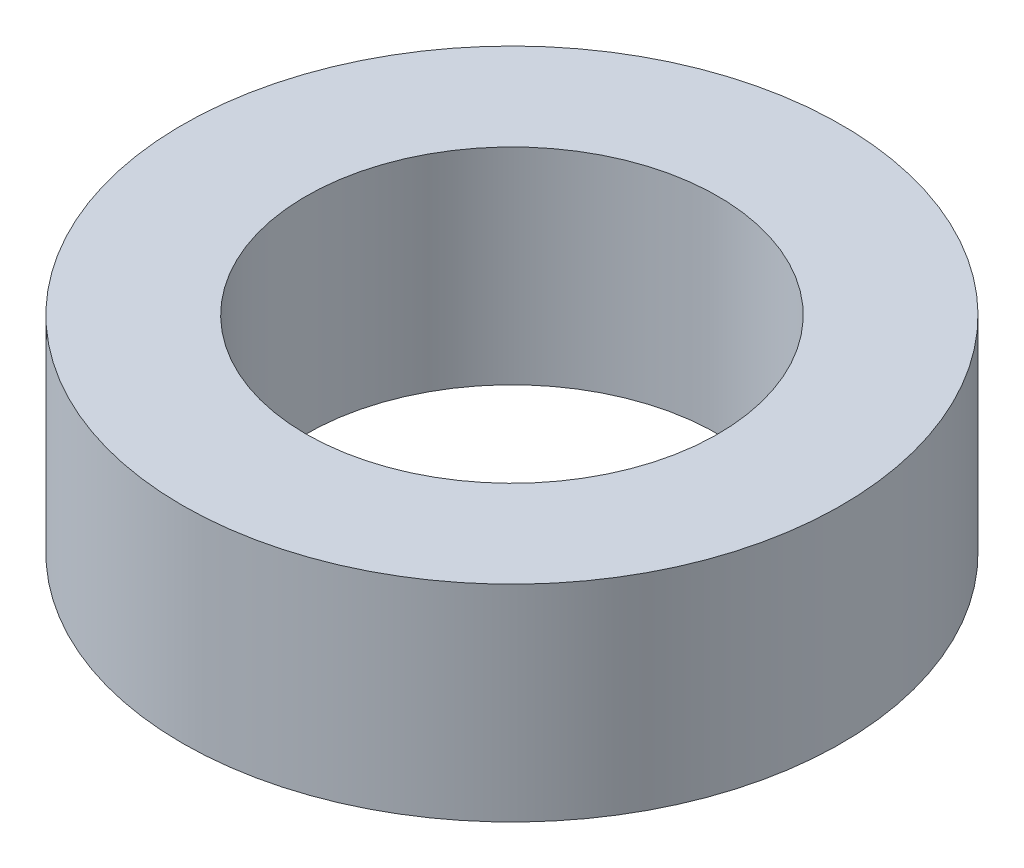
ISO-10303-21;
HEADER;
FILE_DESCRIPTION(('STEP AP214'),'2;1');
FILE_NAME('part.step','',(''),(''),'','','');
FILE_SCHEMA(('AUTOMOTIVE_DESIGN { 1 0 10303 214 1 1 1 1 }'));
ENDSEC;
DATA;
#1=APPLICATION_CONTEXT('core data for automotive mechanical design processes');
#2=APPLICATION_PROTOCOL_DEFINITION('international standard','automotive_design',2000,#1);
#3=PRODUCT_CONTEXT('',#1,'mechanical');
#4=PRODUCT('Part','Part','',(#3));
#5=PRODUCT_RELATED_PRODUCT_CATEGORY('part','',(#4));
#6=PRODUCT_DEFINITION_FORMATION('','',#4);
#7=PRODUCT_DEFINITION_CONTEXT('part definition',#1,'design');
#8=PRODUCT_DEFINITION('design','',#6,#7);
#9=PRODUCT_DEFINITION_SHAPE('','',#8);
#10=(LENGTH_UNIT() NAMED_UNIT(*) SI_UNIT(.MILLI.,.METRE.));
#11=(NAMED_UNIT(*) PLANE_ANGLE_UNIT() SI_UNIT($,.RADIAN.));
#12=(NAMED_UNIT(*) SI_UNIT($,.STERADIAN.) SOLID_ANGLE_UNIT());
#13=UNCERTAINTY_MEASURE_WITH_UNIT(LENGTH_MEASURE(1.E-05),#10,'distance_accuracy_value','');
#14=(GEOMETRIC_REPRESENTATION_CONTEXT(3) GLOBAL_UNCERTAINTY_ASSIGNED_CONTEXT((#13)) GLOBAL_UNIT_ASSIGNED_CONTEXT((#10,
#11,#12)) REPRESENTATION_CONTEXT('',''));
#15=CARTESIAN_POINT('',(0.,0.,0.));
#16=DIRECTION('',(0.,0.,1.));
#17=DIRECTION('',(1.,0.,0.));
#18=AXIS2_PLACEMENT_3D('',#15,#16,#17);
#19=CARTESIAN_POINT('',(0.,3.175,0.));
#20=DIRECTION('',(0.,1.,0.));
#21=DIRECTION('',(0.,0.,1.));
#22=AXIS2_PLACEMENT_3D('',#19,#20,#21);
#23=PLANE('',#22);
#24=CARTESIAN_POINT('',(0.,3.175,0.));
#25=DIRECTION('',(0.,1.,0.));
#26=DIRECTION('',(0.,0.,1.));
#27=AXIS2_PLACEMENT_3D('',#24,#25,#26);
#28=CIRCLE('',#27,5.08);
#29=CARTESIAN_POINT('',(0.,3.175,5.08));
#30=VERTEX_POINT('',#29);
#31=EDGE_CURVE('E10',#30,#30,#28,.T.);
#32=ORIENTED_EDGE('',*,*,#31,.T.);
#33=EDGE_LOOP('',(#32));
#34=FACE_BOUND('',#33,.T.);
#35=CARTESIAN_POINT('',(0.,3.175,0.));
#36=DIRECTION('',(0.,1.,0.));
#37=DIRECTION('',(0.,0.,1.));
#38=AXIS2_PLACEMENT_3D('',#35,#36,#37);
#39=CIRCLE('',#38,3.175);
#40=CARTESIAN_POINT('',(0.,3.175,3.175));
#41=VERTEX_POINT('',#40);
#42=EDGE_CURVE('E54',#41,#41,#39,.T.);
#43=ORIENTED_EDGE('',*,*,#42,.F.);
#44=EDGE_LOOP('',(#43));
#45=FACE_BOUND('',#44,.T.);
#46=ADVANCED_FACE('F41',(#34,#45),#23,.T.);
#47=CARTESIAN_POINT('',(0.,0.,0.));
#48=DIRECTION('',(0.,1.,0.));
#49=DIRECTION('',(0.,0.,1.));
#50=AXIS2_PLACEMENT_3D('',#47,#48,#49);
#51=PLANE('',#50);
#52=CARTESIAN_POINT('',(0.,0.,0.));
#53=DIRECTION('',(0.,1.,0.));
#54=DIRECTION('',(0.,0.,1.));
#55=AXIS2_PLACEMENT_3D('',#52,#53,#54);
#56=CIRCLE('',#55,5.08);
#57=CARTESIAN_POINT('',(0.,0.,5.08));
#58=VERTEX_POINT('',#57);
#59=EDGE_CURVE('E45',#58,#58,#56,.T.);
#60=ORIENTED_EDGE('',*,*,#59,.F.);
#61=EDGE_LOOP('',(#60));
#62=FACE_BOUND('',#61,.T.);
#63=CARTESIAN_POINT('',(0.,0.,0.));
#64=DIRECTION('',(0.,1.,0.));
#65=DIRECTION('',(0.,0.,1.));
#66=AXIS2_PLACEMENT_3D('',#63,#64,#65);
#67=CIRCLE('',#66,3.175);
#68=CARTESIAN_POINT('',(0.,0.,3.175));
#69=VERTEX_POINT('',#68);
#70=EDGE_CURVE('E56',#69,#69,#67,.T.);
#71=ORIENTED_EDGE('',*,*,#70,.T.);
#72=EDGE_LOOP('',(#71));
#73=FACE_BOUND('',#72,.T.);
#74=ADVANCED_FACE('F68',(#62,#73),#51,.F.);
#75=CARTESIAN_POINT('',(0.,3.175,0.));
#76=DIRECTION('',(0.,-1.,0.));
#77=DIRECTION('',(0.,0.,-1.));
#78=AXIS2_PLACEMENT_3D('',#75,#76,#77);
#79=CYLINDRICAL_SURFACE('',#78,5.08);
#80=ORIENTED_EDGE('',*,*,#31,.F.);
#81=EDGE_LOOP('',(#80));
#82=FACE_BOUND('',#81,.T.);
#83=ORIENTED_EDGE('',*,*,#59,.T.);
#84=EDGE_LOOP('',(#83));
#85=FACE_BOUND('',#84,.T.);
#86=ADVANCED_FACE('F43',(#82,#85),#79,.T.);
#87=CARTESIAN_POINT('',(0.,3.175,0.));
#88=DIRECTION('',(0.,-1.,0.));
#89=DIRECTION('',(0.,0.,-1.));
#90=AXIS2_PLACEMENT_3D('',#87,#88,#89);
#91=CYLINDRICAL_SURFACE('',#90,3.175);
#92=ORIENTED_EDGE('',*,*,#42,.T.);
#93=EDGE_LOOP('',(#92));
#94=FACE_BOUND('',#93,.T.);
#95=ORIENTED_EDGE('',*,*,#70,.F.);
#96=EDGE_LOOP('',(#95));
#97=FACE_BOUND('',#96,.T.);
#98=ADVANCED_FACE('F64',(#94,#97),#91,.F.);
#99=CLOSED_SHELL('',(#46,#74,#86,#98));
#100=MANIFOLD_SOLID_BREP('B2',#99);
#101=ADVANCED_BREP_SHAPE_REPRESENTATION('',(#18,#100),#14);
#102=SHAPE_DEFINITION_REPRESENTATION(#9,#101);
ENDSEC;
END-ISO-10303-21;
